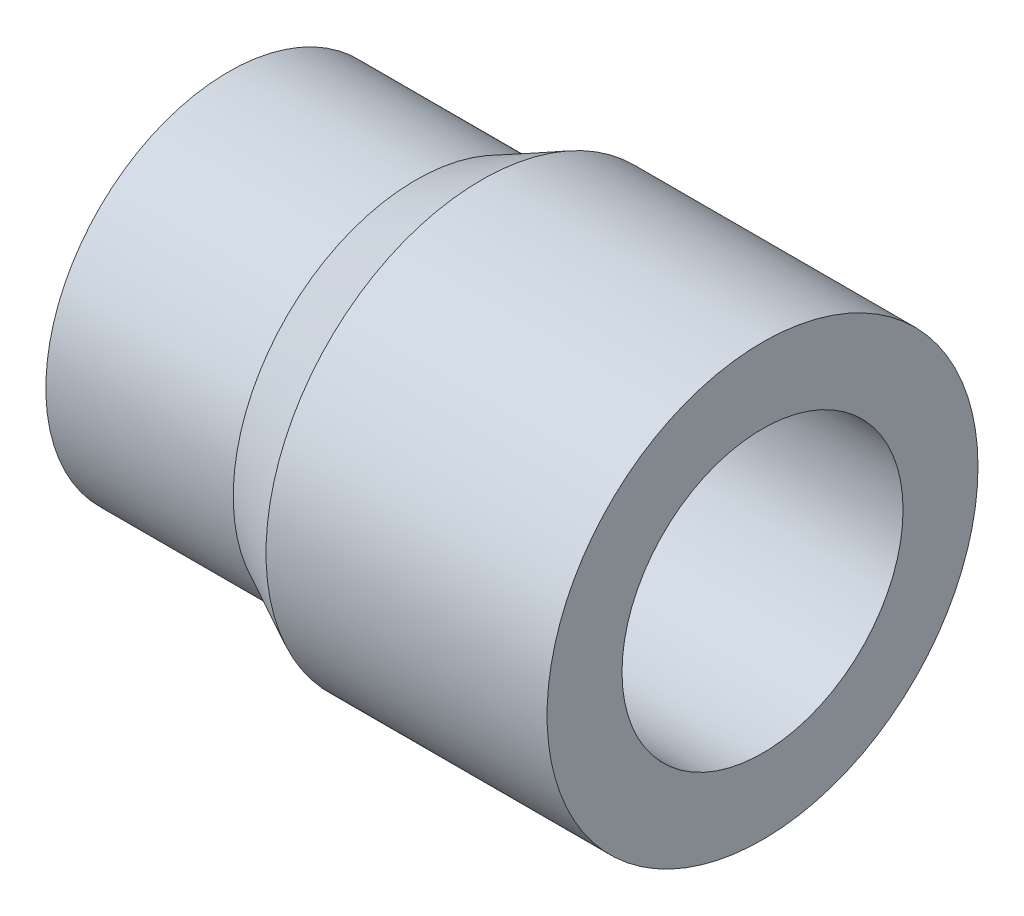
ISO-10303-21;
HEADER;
FILE_DESCRIPTION(('STEP AP214'),'2;1');
FILE_NAME('part.step','',(''),(''),'','','');
FILE_SCHEMA(('AUTOMOTIVE_DESIGN { 1 0 10303 214 1 1 1 1 }'));
ENDSEC;
DATA;
#1=APPLICATION_CONTEXT('core data for automotive mechanical design processes');
#2=APPLICATION_PROTOCOL_DEFINITION('international standard','automotive_design',2000,#1);
#3=PRODUCT_CONTEXT('',#1,'mechanical');
#4=PRODUCT('Part','Part','',(#3));
#5=PRODUCT_RELATED_PRODUCT_CATEGORY('part','',(#4));
#6=PRODUCT_DEFINITION_FORMATION('','',#4);
#7=PRODUCT_DEFINITION_CONTEXT('part definition',#1,'design');
#8=PRODUCT_DEFINITION('design','',#6,#7);
#9=PRODUCT_DEFINITION_SHAPE('','',#8);
#10=(LENGTH_UNIT() NAMED_UNIT(*) SI_UNIT(.MILLI.,.METRE.));
#11=(NAMED_UNIT(*) PLANE_ANGLE_UNIT() SI_UNIT($,.RADIAN.));
#12=(NAMED_UNIT(*) SI_UNIT($,.STERADIAN.) SOLID_ANGLE_UNIT());
#13=UNCERTAINTY_MEASURE_WITH_UNIT(LENGTH_MEASURE(1.E-05),#10,'distance_accuracy_value','');
#14=(GEOMETRIC_REPRESENTATION_CONTEXT(3) GLOBAL_UNCERTAINTY_ASSIGNED_CONTEXT((#13)) GLOBAL_UNIT_ASSIGNED_CONTEXT((#10,
#11,#12)) REPRESENTATION_CONTEXT('',''));
#15=CARTESIAN_POINT('',(0.,0.,0.));
#16=DIRECTION('',(0.,0.,1.));
#17=DIRECTION('',(1.,0.,0.));
#18=AXIS2_PLACEMENT_3D('',#15,#16,#17);
#19=CARTESIAN_POINT('',(0.,0.,0.));
#20=DIRECTION('',(1.,0.,0.));
#21=DIRECTION('',(0.,0.,-1.));
#22=AXIS2_PLACEMENT_3D('',#19,#20,#21);
#23=CYLINDRICAL_SURFACE('',#22,2.3);
#24=CARTESIAN_POINT('',(0.,0.,0.));
#25=DIRECTION('',(1.,0.,0.));
#26=DIRECTION('',(0.,0.,-1.));
#27=AXIS2_PLACEMENT_3D('',#24,#25,#26);
#28=CIRCLE('',#27,2.3);
#29=CARTESIAN_POINT('',(0.,0.,-2.3));
#30=VERTEX_POINT('',#29);
#31=EDGE_CURVE('E10',#30,#30,#28,.T.);
#32=ORIENTED_EDGE('',*,*,#31,.F.);
#33=EDGE_LOOP('',(#32));
#34=FACE_BOUND('',#33,.T.);
#35=CARTESIAN_POINT('',(-3.,0.,0.));
#36=DIRECTION('',(1.,0.,0.));
#37=DIRECTION('',(0.,0.,-1.));
#38=AXIS2_PLACEMENT_3D('',#35,#36,#37);
#39=CIRCLE('',#38,2.3);
#40=CARTESIAN_POINT('',(-3.,0.,-2.3));
#41=VERTEX_POINT('',#40);
#42=EDGE_CURVE('E59',#41,#41,#39,.T.);
#43=ORIENTED_EDGE('',*,*,#42,.T.);
#44=EDGE_LOOP('',(#43));
#45=FACE_BOUND('',#44,.T.);
#46=ADVANCED_FACE('F37',(#34,#45),#23,.T.);
#47=CARTESIAN_POINT('',(0.,0.,2.3));
#48=DIRECTION('',(-1.,0.,0.));
#49=DIRECTION('',(0.,0.,1.));
#50=AXIS2_PLACEMENT_3D('',#47,#48,#49);
#51=PLANE('',#50);
#52=CARTESIAN_POINT('',(0.,0.,0.));
#53=DIRECTION('',(1.,0.,0.));
#54=DIRECTION('',(0.,0.,-1.));
#55=AXIS2_PLACEMENT_3D('',#52,#53,#54);
#56=CIRCLE('',#55,1.5);
#57=CARTESIAN_POINT('',(0.,0.,-1.5));
#58=VERTEX_POINT('',#57);
#59=EDGE_CURVE('E43',#58,#58,#56,.T.);
#60=ORIENTED_EDGE('',*,*,#59,.F.);
#61=EDGE_LOOP('',(#60));
#62=FACE_BOUND('',#61,.T.);
#63=ORIENTED_EDGE('',*,*,#31,.T.);
#64=EDGE_LOOP('',(#63));
#65=FACE_BOUND('',#64,.T.);
#66=ADVANCED_FACE('F84',(#62,#65),#51,.F.);
#67=CARTESIAN_POINT('',(0.,0.,0.));
#68=DIRECTION('',(1.,0.,0.));
#69=DIRECTION('',(0.,0.,-1.));
#70=AXIS2_PLACEMENT_3D('',#67,#68,#69);
#71=CYLINDRICAL_SURFACE('',#70,1.5);
#72=CARTESIAN_POINT('',(-5.7,0.,0.));
#73=DIRECTION('',(1.,0.,0.));
#74=DIRECTION('',(0.,0.,-1.));
#75=AXIS2_PLACEMENT_3D('',#72,#73,#74);
#76=CIRCLE('',#75,1.5);
#77=CARTESIAN_POINT('',(-5.7,0.,-1.5));
#78=VERTEX_POINT('',#77);
#79=EDGE_CURVE('E47',#78,#78,#76,.T.);
#80=ORIENTED_EDGE('',*,*,#79,.F.);
#81=EDGE_LOOP('',(#80));
#82=FACE_BOUND('',#81,.T.);
#83=ORIENTED_EDGE('',*,*,#59,.T.);
#84=EDGE_LOOP('',(#83));
#85=FACE_BOUND('',#84,.T.);
#86=ADVANCED_FACE('F79',(#82,#85),#71,.F.);
#87=CARTESIAN_POINT('',(-5.7,0.,1.5));
#88=DIRECTION('',(1.,0.,0.));
#89=DIRECTION('',(0.,0.,-1.));
#90=AXIS2_PLACEMENT_3D('',#87,#88,#89);
#91=PLANE('',#90);
#92=CARTESIAN_POINT('',(-5.7,0.,0.));
#93=DIRECTION('',(1.,0.,0.));
#94=DIRECTION('',(0.,0.,-1.));
#95=AXIS2_PLACEMENT_3D('',#92,#93,#94);
#96=CIRCLE('',#95,1.95);
#97=CARTESIAN_POINT('',(-5.7,0.,-1.95));
#98=VERTEX_POINT('',#97);
#99=EDGE_CURVE('E51',#98,#98,#96,.T.);
#100=ORIENTED_EDGE('',*,*,#99,.F.);
#101=EDGE_LOOP('',(#100));
#102=FACE_BOUND('',#101,.T.);
#103=ORIENTED_EDGE('',*,*,#79,.T.);
#104=EDGE_LOOP('',(#103));
#105=FACE_BOUND('',#104,.T.);
#106=ADVANCED_FACE('F73',(#102,#105),#91,.F.);
#107=CARTESIAN_POINT('',(0.,0.,0.));
#108=DIRECTION('',(1.,0.,0.));
#109=DIRECTION('',(0.,0.,-1.));
#110=AXIS2_PLACEMENT_3D('',#107,#108,#109);
#111=CYLINDRICAL_SURFACE('',#110,1.95);
#112=CARTESIAN_POINT('',(-3.7,0.,0.));
#113=DIRECTION('',(1.,0.,0.));
#114=DIRECTION('',(0.,0.,-1.));
#115=AXIS2_PLACEMENT_3D('',#112,#113,#114);
#116=CIRCLE('',#115,1.95);
#117=CARTESIAN_POINT('',(-3.7,0.,-1.95));
#118=VERTEX_POINT('',#117);
#119=EDGE_CURVE('E56',#118,#118,#116,.T.);
#120=ORIENTED_EDGE('',*,*,#119,.F.);
#121=EDGE_LOOP('',(#120));
#122=FACE_BOUND('',#121,.T.);
#123=ORIENTED_EDGE('',*,*,#99,.T.);
#124=EDGE_LOOP('',(#123));
#125=FACE_BOUND('',#124,.T.);
#126=ADVANCED_FACE('F67',(#122,#125),#111,.T.);
#127=CARTESIAN_POINT('',(-3.7,0.,0.));
#128=DIRECTION('',(1.,0.,0.));
#129=DIRECTION('',(0.,0.,-1.));
#130=AXIS2_PLACEMENT_3D('',#127,#128,#129);
#131=CONICAL_SURFACE('',#130,1.95,0.463647609000807);
#132=ORIENTED_EDGE('',*,*,#42,.F.);
#133=EDGE_LOOP('',(#132));
#134=FACE_BOUND('',#133,.T.);
#135=ORIENTED_EDGE('',*,*,#119,.T.);
#136=EDGE_LOOP('',(#135));
#137=FACE_BOUND('',#136,.T.);
#138=ADVANCED_FACE('F64',(#134,#137),#131,.T.);
#139=CLOSED_SHELL('',(#46,#66,#86,#106,#126,#138));
#140=MANIFOLD_SOLID_BREP('B2',#139);
#141=ADVANCED_BREP_SHAPE_REPRESENTATION('',(#18,#140),#14);
#142=SHAPE_DEFINITION_REPRESENTATION(#9,#141);
ENDSEC;
END-ISO-10303-21;
